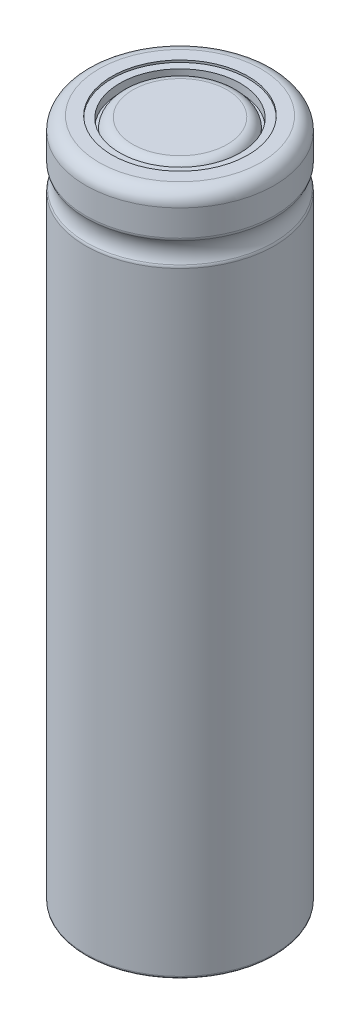
ISO-10303-21;
HEADER;
FILE_DESCRIPTION(('STEP AP214'),'2;1');
FILE_NAME('part.step','',(''),(''),'','','');
FILE_SCHEMA(('AUTOMOTIVE_DESIGN { 1 0 10303 214 1 1 1 1 }'));
ENDSEC;
DATA;
#1=APPLICATION_CONTEXT('core data for automotive mechanical design processes');
#2=APPLICATION_PROTOCOL_DEFINITION('international standard','automotive_design',2000,#1);
#3=PRODUCT_CONTEXT('',#1,'mechanical');
#4=PRODUCT('Part','Part','',(#3));
#5=PRODUCT_RELATED_PRODUCT_CATEGORY('part','',(#4));
#6=PRODUCT_DEFINITION_FORMATION('','',#4);
#7=PRODUCT_DEFINITION_CONTEXT('part definition',#1,'design');
#8=PRODUCT_DEFINITION('design','',#6,#7);
#9=PRODUCT_DEFINITION_SHAPE('','',#8);
#10=(LENGTH_UNIT() NAMED_UNIT(*) SI_UNIT(.MILLI.,.METRE.));
#11=(NAMED_UNIT(*) PLANE_ANGLE_UNIT() SI_UNIT($,.RADIAN.));
#12=(NAMED_UNIT(*) SI_UNIT($,.STERADIAN.) SOLID_ANGLE_UNIT());
#13=UNCERTAINTY_MEASURE_WITH_UNIT(LENGTH_MEASURE(1.E-05),#10,'distance_accuracy_value','');
#14=(GEOMETRIC_REPRESENTATION_CONTEXT(3) GLOBAL_UNCERTAINTY_ASSIGNED_CONTEXT((#13)) GLOBAL_UNIT_ASSIGNED_CONTEXT((#10,
#11,#12)) REPRESENTATION_CONTEXT('',''));
#15=CARTESIAN_POINT('',(0.,0.,0.));
#16=DIRECTION('',(0.,0.,1.));
#17=DIRECTION('',(1.,0.,0.));
#18=AXIS2_PLACEMENT_3D('',#15,#16,#17);
#19=CARTESIAN_POINT('',(0.,0.225400000000001,0.));
#20=DIRECTION('',(0.,-1.,0.));
#21=DIRECTION('',(0.,0.,1.));
#22=AXIS2_PLACEMENT_3D('',#19,#20,#21);
#23=PLANE('',#22);
#24=CARTESIAN_POINT('',(0.,0.225400000000001,0.));
#25=DIRECTION('',(0.,-1.,0.));
#26=DIRECTION('',(0.,0.,-1.));
#27=AXIS2_PLACEMENT_3D('',#24,#25,#26);
#28=CIRCLE('',#27,7.5);
#29=CARTESIAN_POINT('',(0.,0.225400000000001,7.5));
#30=VERTEX_POINT('',#29);
#31=EDGE_CURVE('E148',#30,#30,#28,.T.);
#32=ORIENTED_EDGE('',*,*,#31,.T.);
#33=EDGE_LOOP('',(#32));
#34=FACE_BOUND('',#33,.T.);
#35=ADVANCED_FACE('F16',(#34),#23,.T.);
#36=CARTESIAN_POINT('',(0.,64.873,7.73));
#37=DIRECTION('',(0.,1.,0.));
#38=DIRECTION('',(0.,0.,1.));
#39=AXIS2_PLACEMENT_3D('',#36,#37,#38);
#40=PLANE('',#39);
#41=CARTESIAN_POINT('',(0.,64.873,0.));
#42=DIRECTION('',(0.,1.,0.));
#43=DIRECTION('',(-1.,0.,0.));
#44=AXIS2_PLACEMENT_3D('',#41,#42,#43);
#45=CIRCLE('',#44,4.50617959368908);
#46=CARTESIAN_POINT('',(-4.50617959368908,64.873,0.));
#47=VERTEX_POINT('',#46);
#48=EDGE_CURVE('E152',#47,#47,#45,.T.);
#49=ORIENTED_EDGE('',*,*,#48,.T.);
#50=EDGE_LOOP('',(#49));
#51=FACE_BOUND('',#50,.T.);
#52=ADVANCED_FACE('F215',(#51),#40,.T.);
#53=CARTESIAN_POINT('',(0.,0.,0.));
#54=DIRECTION('',(0.,-1.,0.));
#55=DIRECTION('',(1.,0.,0.));
#56=AXIS2_PLACEMENT_3D('',#53,#54,#55);
#57=PLANE('',#56);
#58=CARTESIAN_POINT('',(0.,0.,0.));
#59=DIRECTION('',(0.,-1.,0.));
#60=DIRECTION('',(0.,0.,-1.));
#61=AXIS2_PLACEMENT_3D('',#58,#59,#60);
#62=CIRCLE('',#61,7.5);
#63=CARTESIAN_POINT('',(0.,0.,7.5));
#64=VERTEX_POINT('',#63);
#65=EDGE_CURVE('E138',#64,#64,#62,.T.);
#66=ORIENTED_EDGE('',*,*,#65,.F.);
#67=EDGE_LOOP('',(#66));
#68=FACE_BOUND('',#67,.T.);
#69=CARTESIAN_POINT('',(0.,0.,0.));
#70=DIRECTION('',(0.,1.,0.));
#71=DIRECTION('',(-1.,0.,0.));
#72=AXIS2_PLACEMENT_3D('',#69,#70,#71);
#73=CIRCLE('',#72,8.746);
#74=CARTESIAN_POINT('',(8.746,0.,0.));
#75=VERTEX_POINT('',#74);
#76=EDGE_CURVE('E108',#75,#75,#73,.T.);
#77=ORIENTED_EDGE('',*,*,#76,.F.);
#78=EDGE_LOOP('',(#77));
#79=FACE_BOUND('',#78,.T.);
#80=ADVANCED_FACE('F220',(#68,#79),#57,.T.);
#81=CARTESIAN_POINT('',(0.,65.,7.73));
#82=DIRECTION('',(0.,1.,0.));
#83=DIRECTION('',(0.,0.,1.));
#84=AXIS2_PLACEMENT_3D('',#81,#82,#83);
#85=PLANE('',#84);
#86=CARTESIAN_POINT('',(0.,65.,0.));
#87=DIRECTION('',(0.,-1.,0.));
#88=DIRECTION('',(-1.,0.,0.));
#89=AXIS2_PLACEMENT_3D('',#86,#87,#88);
#90=CIRCLE('',#89,6.5);
#91=CARTESIAN_POINT('',(6.5,65.,0.));
#92=VERTEX_POINT('',#91);
#93=EDGE_CURVE('E283',#92,#92,#90,.T.);
#94=ORIENTED_EDGE('',*,*,#93,.T.);
#95=EDGE_LOOP('',(#94));
#96=FACE_BOUND('',#95,.T.);
#97=CARTESIAN_POINT('',(0.,65.,0.));
#98=DIRECTION('',(0.,1.,0.));
#99=DIRECTION('',(-1.,0.,0.));
#100=AXIS2_PLACEMENT_3D('',#97,#98,#99);
#101=CIRCLE('',#100,7.73);
#102=CARTESIAN_POINT('',(7.73,65.,0.));
#103=VERTEX_POINT('',#102);
#104=EDGE_CURVE('E19',#103,#103,#101,.T.);
#105=ORIENTED_EDGE('',*,*,#104,.T.);
#106=EDGE_LOOP('',(#105));
#107=FACE_BOUND('',#106,.T.);
#108=ADVANCED_FACE('F197',(#96,#107),#85,.T.);
#109=CARTESIAN_POINT('',(0.,63.984,0.));
#110=DIRECTION('',(0.,1.,0.));
#111=DIRECTION('',(0.,0.,1.));
#112=AXIS2_PLACEMENT_3D('',#109,#110,#111);
#113=PLANE('',#112);
#114=CARTESIAN_POINT('',(0.,63.984,0.));
#115=DIRECTION('',(0.,1.,0.));
#116=DIRECTION('',(0.,0.,1.));
#117=AXIS2_PLACEMENT_3D('',#114,#115,#116);
#118=CIRCLE('',#117,5.5);
#119=CARTESIAN_POINT('',(-5.5,63.984,0.));
#120=VERTEX_POINT('',#119);
#121=EDGE_CURVE('E143',#120,#120,#118,.T.);
#122=ORIENTED_EDGE('',*,*,#121,.F.);
#123=EDGE_LOOP('',(#122));
#124=FACE_BOUND('',#123,.T.);
#125=CARTESIAN_POINT('',(0.,63.984,0.));
#126=DIRECTION('',(0.,1.,0.));
#127=DIRECTION('',(0.,0.,1.));
#128=AXIS2_PLACEMENT_3D('',#125,#126,#127);
#129=CIRCLE('',#128,5.75);
#130=CARTESIAN_POINT('',(0.,63.984,-5.75));
#131=VERTEX_POINT('',#130);
#132=EDGE_CURVE('E141',#131,#131,#129,.T.);
#133=ORIENTED_EDGE('',*,*,#132,.T.);
#134=EDGE_LOOP('',(#133));
#135=FACE_BOUND('',#134,.T.);
#136=ADVANCED_FACE('F201',(#124,#135),#113,.T.);
#137=CARTESIAN_POINT('',(0.,63.73,0.));
#138=DIRECTION('',(0.,1.,0.));
#139=DIRECTION('',(-1.,0.,0.));
#140=AXIS2_PLACEMENT_3D('',#137,#138,#139);
#141=TOROIDAL_SURFACE('',#140,7.73,1.27);
#142=ORIENTED_EDGE('',*,*,#104,.F.);
#143=CARTESIAN_POINT('',(7.73,63.73,0.));
#144=DIRECTION('',(0.,0.,-1.));
#145=DIRECTION('',(1.,0.,0.));
#146=AXIS2_PLACEMENT_3D('',#143,#144,#145);
#147=CIRCLE('',#146,1.27);
#148=CARTESIAN_POINT('',(9.,63.73,0.));
#149=VERTEX_POINT('',#148);
#150=EDGE_CURVE('E10',#103,#149,#147,.T.);
#151=ORIENTED_EDGE('',*,*,#150,.T.);
#152=CARTESIAN_POINT('',(0.,63.73,0.));
#153=DIRECTION('',(0.,1.,0.));
#154=DIRECTION('',(-1.,0.,0.));
#155=AXIS2_PLACEMENT_3D('',#152,#153,#154);
#156=CIRCLE('',#155,9.);
#157=EDGE_CURVE('E184',#149,#149,#156,.T.);
#158=ORIENTED_EDGE('',*,*,#157,.T.);
#159=ORIENTED_EDGE('',*,*,#150,.F.);
#160=EDGE_LOOP('',(#142,#151,#158,#159));
#161=FACE_BOUND('',#160,.T.);
#162=ADVANCED_FACE('F198',(#161),#141,.T.);
#163=CARTESIAN_POINT('',(0.,65.,0.));
#164=DIRECTION('',(0.,1.,0.));
#165=DIRECTION('',(-1.,0.,0.));
#166=AXIS2_PLACEMENT_3D('',#163,#164,#165);
#167=CYLINDRICAL_SURFACE('',#166,9.);
#168=ORIENTED_EDGE('',*,*,#157,.F.);
#169=DIRECTION('',(0.,-1.,0.));
#170=VECTOR('',#169,1.);
#171=CARTESIAN_POINT('',(9.,65.,0.));
#172=LINE('',#171,#170);
#173=CARTESIAN_POINT('',(9.,61.23,0.));
#174=VERTEX_POINT('',#173);
#175=EDGE_CURVE('E186',#149,#174,#172,.T.);
#176=ORIENTED_EDGE('',*,*,#175,.T.);
#177=CARTESIAN_POINT('',(0.,61.23,0.));
#178=DIRECTION('',(0.,-1.,0.));
#179=DIRECTION('',(1.,0.,0.));
#180=AXIS2_PLACEMENT_3D('',#177,#178,#179);
#181=CIRCLE('',#180,9.);
#182=CARTESIAN_POINT('',(-9.,61.23,0.));
#183=VERTEX_POINT('',#182);
#184=EDGE_CURVE('E177',#183,#174,#181,.T.);
#185=ORIENTED_EDGE('',*,*,#184,.F.);
#186=CARTESIAN_POINT('',(0.,61.23,0.));
#187=DIRECTION('',(0.,-1.,0.));
#188=DIRECTION('',(1.,0.,0.));
#189=AXIS2_PLACEMENT_3D('',#186,#187,#188);
#190=CIRCLE('',#189,9.);
#191=EDGE_CURVE('E181',#174,#183,#190,.T.);
#192=ORIENTED_EDGE('',*,*,#191,.F.);
#193=ORIENTED_EDGE('',*,*,#175,.F.);
#194=EDGE_LOOP('',(#168,#176,#185,#192,#193));
#195=FACE_BOUND('',#194,.T.);
#196=ADVANCED_FACE('F200',(#195),#167,.T.);
#197=CARTESIAN_POINT('',(0.,61.23,0.));
#198=DIRECTION('',(0.,-1.,0.));
#199=DIRECTION('',(1.,0.,0.));
#200=AXIS2_PLACEMENT_3D('',#197,#198,#199);
#201=TOROIDAL_SURFACE('',#200,8.5,0.5);
#202=CARTESIAN_POINT('',(0.,60.98,0.));
#203=DIRECTION('',(0.,-1.,0.));
#204=DIRECTION('',(1.,0.,0.));
#205=AXIS2_PLACEMENT_3D('',#202,#203,#204);
#206=CIRCLE('',#205,8.93301270189221);
#207=CARTESIAN_POINT('',(-8.93301270189221,60.98,0.));
#208=VERTEX_POINT('',#207);
#209=EDGE_CURVE('E136',#208,#208,#206,.T.);
#210=ORIENTED_EDGE('',*,*,#209,.F.);
#211=CARTESIAN_POINT('',(-8.5,61.23,0.));
#212=DIRECTION('',(0.,0.,-1.));
#213=DIRECTION('',(-1.,0.,0.));
#214=AXIS2_PLACEMENT_3D('',#211,#212,#213);
#215=CIRCLE('',#214,0.5);
#216=EDGE_CURVE('E121',#208,#183,#215,.T.);
#217=ORIENTED_EDGE('',*,*,#216,.T.);
#218=ORIENTED_EDGE('',*,*,#184,.T.);
#219=ORIENTED_EDGE('',*,*,#191,.T.);
#220=ORIENTED_EDGE('',*,*,#216,.F.);
#221=EDGE_LOOP('',(#210,#217,#218,#219,#220));
#222=FACE_BOUND('',#221,.T.);
#223=ADVANCED_FACE('F208',(#222),#201,.T.);
#224=CARTESIAN_POINT('',(0.,58.73,0.));
#225=DIRECTION('',(0.,-1.,0.));
#226=DIRECTION('',(1.,0.,0.));
#227=AXIS2_PLACEMENT_3D('',#224,#225,#226);
#228=TOROIDAL_SURFACE('',#227,8.5,0.5);
#229=CARTESIAN_POINT('',(0.,58.73,0.));
#230=DIRECTION('',(0.,-1.,0.));
#231=DIRECTION('',(1.,0.,0.));
#232=AXIS2_PLACEMENT_3D('',#229,#230,#231);
#233=CIRCLE('',#232,9.);
#234=CARTESIAN_POINT('',(-9.,58.73,0.));
#235=VERTEX_POINT('',#234);
#236=CARTESIAN_POINT('',(9.,58.73,0.));
#237=VERTEX_POINT('',#236);
#238=EDGE_CURVE('E156',#235,#237,#233,.T.);
#239=ORIENTED_EDGE('',*,*,#238,.F.);
#240=CARTESIAN_POINT('',(-8.5,58.73,0.));
#241=DIRECTION('',(0.,0.,-1.));
#242=DIRECTION('',(-1.,0.,0.));
#243=AXIS2_PLACEMENT_3D('',#240,#241,#242);
#244=CIRCLE('',#243,0.5);
#245=CARTESIAN_POINT('',(-8.93301270189221,58.98,0.));
#246=VERTEX_POINT('',#245);
#247=EDGE_CURVE('E115',#235,#246,#244,.T.);
#248=ORIENTED_EDGE('',*,*,#247,.T.);
#249=CARTESIAN_POINT('',(0.,58.98,0.));
#250=DIRECTION('',(0.,-1.,0.));
#251=DIRECTION('',(1.,0.,0.));
#252=AXIS2_PLACEMENT_3D('',#249,#250,#251);
#253=CIRCLE('',#252,8.93301270189221);
#254=EDGE_CURVE('E128',#246,#246,#253,.T.);
#255=ORIENTED_EDGE('',*,*,#254,.T.);
#256=ORIENTED_EDGE('',*,*,#247,.F.);
#257=CARTESIAN_POINT('',(0.,58.73,0.));
#258=DIRECTION('',(0.,-1.,0.));
#259=DIRECTION('',(1.,0.,0.));
#260=AXIS2_PLACEMENT_3D('',#257,#258,#259);
#261=CIRCLE('',#260,9.);
#262=EDGE_CURVE('E124',#237,#235,#261,.T.);
#263=ORIENTED_EDGE('',*,*,#262,.F.);
#264=EDGE_LOOP('',(#239,#248,#255,#256,#263));
#265=FACE_BOUND('',#264,.T.);
#266=ADVANCED_FACE('F245',(#265),#228,.T.);
#267=CARTESIAN_POINT('',(0.,0.254000000000004,0.));
#268=DIRECTION('',(0.,1.,0.));
#269=DIRECTION('',(-1.,0.,0.));
#270=AXIS2_PLACEMENT_3D('',#267,#268,#269);
#271=TOROIDAL_SURFACE('',#270,8.746,0.254);
#272=CARTESIAN_POINT('',(0.,0.254000000000004,0.));
#273=DIRECTION('',(0.,1.,0.));
#274=DIRECTION('',(-1.,0.,0.));
#275=AXIS2_PLACEMENT_3D('',#272,#273,#274);
#276=CIRCLE('',#275,9.);
#277=CARTESIAN_POINT('',(9.,0.254000000000004,0.));
#278=VERTEX_POINT('',#277);
#279=EDGE_CURVE('E132',#278,#278,#276,.T.);
#280=ORIENTED_EDGE('',*,*,#279,.F.);
#281=CARTESIAN_POINT('',(8.746,0.254000000000004,0.));
#282=DIRECTION('',(0.,0.,-1.));
#283=DIRECTION('',(1.,0.,0.));
#284=AXIS2_PLACEMENT_3D('',#281,#282,#283);
#285=CIRCLE('',#284,0.254);
#286=EDGE_CURVE('E111',#278,#75,#285,.T.);
#287=ORIENTED_EDGE('',*,*,#286,.T.);
#288=ORIENTED_EDGE('',*,*,#76,.T.);
#289=ORIENTED_EDGE('',*,*,#286,.F.);
#290=EDGE_LOOP('',(#280,#287,#288,#289));
#291=FACE_BOUND('',#290,.T.);
#292=ADVANCED_FACE('F110',(#291),#271,.T.);
#293=CARTESIAN_POINT('',(0.,65.,0.));
#294=DIRECTION('',(0.,1.,0.));
#295=DIRECTION('',(-1.,0.,0.));
#296=AXIS2_PLACEMENT_3D('',#293,#294,#295);
#297=CYLINDRICAL_SURFACE('',#296,9.);
#298=ORIENTED_EDGE('',*,*,#238,.T.);
#299=DIRECTION('',(0.,-1.,0.));
#300=VECTOR('',#299,1.);
#301=CARTESIAN_POINT('',(9.,65.,0.));
#302=LINE('',#301,#300);
#303=EDGE_CURVE('E160',#237,#278,#302,.T.);
#304=ORIENTED_EDGE('',*,*,#303,.T.);
#305=ORIENTED_EDGE('',*,*,#279,.T.);
#306=ORIENTED_EDGE('',*,*,#303,.F.);
#307=ORIENTED_EDGE('',*,*,#262,.T.);
#308=EDGE_LOOP('',(#298,#304,#305,#306,#307));
#309=FACE_BOUND('',#308,.T.);
#310=ADVANCED_FACE('F296',(#309),#297,.T.);
#311=CARTESIAN_POINT('',(0.,63.984,0.));
#312=DIRECTION('',(0.,1.,0.));
#313=DIRECTION('',(0.,0.,1.));
#314=AXIS2_PLACEMENT_3D('',#311,#312,#313);
#315=CYLINDRICAL_SURFACE('',#314,5.75);
#316=ORIENTED_EDGE('',*,*,#132,.F.);
#317=DIRECTION('',(0.,1.,0.));
#318=VECTOR('',#317,1.);
#319=CARTESIAN_POINT('',(0.,63.984,-5.75));
#320=LINE('',#319,#318);
#321=CARTESIAN_POINT('',(0.,64.8,-5.75));
#322=VERTEX_POINT('',#321);
#323=EDGE_CURVE('E161',#131,#322,#320,.T.);
#324=ORIENTED_EDGE('',*,*,#323,.T.);
#325=CARTESIAN_POINT('',(0.,64.8,0.));
#326=DIRECTION('',(0.,1.,0.));
#327=DIRECTION('',(0.,0.,1.));
#328=AXIS2_PLACEMENT_3D('',#325,#326,#327);
#329=CIRCLE('',#328,5.75);
#330=EDGE_CURVE('E278',#322,#322,#329,.T.);
#331=ORIENTED_EDGE('',*,*,#330,.T.);
#332=ORIENTED_EDGE('',*,*,#323,.F.);
#333=EDGE_LOOP('',(#316,#324,#331,#332));
#334=FACE_BOUND('',#333,.T.);
#335=ADVANCED_FACE('F298',(#334),#315,.F.);
#336=CARTESIAN_POINT('',(0.,0.0254000000000018,0.));
#337=DIRECTION('',(0.,-1.,0.));
#338=DIRECTION('',(0.,0.,-1.));
#339=AXIS2_PLACEMENT_3D('',#336,#337,#338);
#340=CYLINDRICAL_SURFACE('',#339,7.5);
#341=ORIENTED_EDGE('',*,*,#31,.F.);
#342=DIRECTION('',(0.,-1.,0.));
#343=VECTOR('',#342,1.);
#344=CARTESIAN_POINT('',(0.,0.0254000000000018,7.5));
#345=LINE('',#344,#343);
#346=EDGE_CURVE('E142',#30,#64,#345,.T.);
#347=ORIENTED_EDGE('',*,*,#346,.T.);
#348=ORIENTED_EDGE('',*,*,#65,.T.);
#349=ORIENTED_EDGE('',*,*,#346,.F.);
#350=EDGE_LOOP('',(#341,#347,#348,#349));
#351=FACE_BOUND('',#350,.T.);
#352=ADVANCED_FACE('F225',(#351),#340,.F.);
#353=CARTESIAN_POINT('',(0.,63.873,0.));
#354=DIRECTION('',(0.,-1.,0.));
#355=DIRECTION('',(1.,0.,0.));
#356=AXIS2_PLACEMENT_3D('',#353,#354,#355);
#357=TOROIDAL_SURFACE('',#356,4.50617959368908,1.);
#358=ORIENTED_EDGE('',*,*,#121,.T.);
#359=CARTESIAN_POINT('',(-4.50617959368908,63.873,0.));
#360=DIRECTION('',(0.,0.,-1.));
#361=DIRECTION('',(-1.,0.,0.));
#362=AXIS2_PLACEMENT_3D('',#359,#360,#361);
#363=CIRCLE('',#362,1.);
#364=EDGE_CURVE('E147',#120,#47,#363,.T.);
#365=ORIENTED_EDGE('',*,*,#364,.T.);
#366=ORIENTED_EDGE('',*,*,#48,.F.);
#367=ORIENTED_EDGE('',*,*,#364,.F.);
#368=EDGE_LOOP('',(#358,#365,#366,#367));
#369=FACE_BOUND('',#368,.T.);
#370=ADVANCED_FACE('F274',(#369),#357,.T.);
#371=CARTESIAN_POINT('',(0.,59.98,0.));
#372=DIRECTION('',(0.,-1.,0.));
#373=DIRECTION('',(1.,0.,0.));
#374=AXIS2_PLACEMENT_3D('',#371,#372,#373);
#375=TOROIDAL_SURFACE('',#374,10.6650635094611,2.);
#376=ORIENTED_EDGE('',*,*,#254,.F.);
#377=CARTESIAN_POINT('',(-10.6650635094611,59.98,0.));
#378=DIRECTION('',(0.,0.,1.));
#379=DIRECTION('',(-1.,0.,0.));
#380=AXIS2_PLACEMENT_3D('',#377,#378,#379);
#381=CIRCLE('',#380,2.);
#382=EDGE_CURVE('E133',#246,#208,#381,.T.);
#383=ORIENTED_EDGE('',*,*,#382,.T.);
#384=ORIENTED_EDGE('',*,*,#209,.T.);
#385=ORIENTED_EDGE('',*,*,#382,.F.);
#386=EDGE_LOOP('',(#376,#383,#384,#385));
#387=FACE_BOUND('',#386,.T.);
#388=ADVANCED_FACE('F241',(#387),#375,.F.);
#389=CARTESIAN_POINT('',(0.,64.8,0.));
#390=DIRECTION('',(0.,1.,0.));
#391=DIRECTION('',(-1.,0.,0.));
#392=AXIS2_PLACEMENT_3D('',#389,#390,#391);
#393=PLANE('',#392);
#394=ORIENTED_EDGE('',*,*,#330,.F.);
#395=EDGE_LOOP('',(#394));
#396=FACE_BOUND('',#395,.T.);
#397=CARTESIAN_POINT('',(0.,64.8,0.));
#398=DIRECTION('',(0.,-1.,0.));
#399=DIRECTION('',(-1.,0.,0.));
#400=AXIS2_PLACEMENT_3D('',#397,#398,#399);
#401=CIRCLE('',#400,6.5);
#402=CARTESIAN_POINT('',(6.5,64.8,0.));
#403=VERTEX_POINT('',#402);
#404=EDGE_CURVE('E233',#403,#403,#401,.T.);
#405=ORIENTED_EDGE('',*,*,#404,.F.);
#406=EDGE_LOOP('',(#405));
#407=FACE_BOUND('',#406,.T.);
#408=ADVANCED_FACE('F266',(#396,#407),#393,.T.);
#409=CARTESIAN_POINT('',(0.,65.,0.));
#410=DIRECTION('',(0.,-1.,0.));
#411=DIRECTION('',(-1.,0.,0.));
#412=AXIS2_PLACEMENT_3D('',#409,#410,#411);
#413=CYLINDRICAL_SURFACE('',#412,6.5);
#414=ORIENTED_EDGE('',*,*,#93,.F.);
#415=DIRECTION('',(0.,-1.,0.));
#416=VECTOR('',#415,1.);
#417=CARTESIAN_POINT('',(6.5,65.,0.));
#418=LINE('',#417,#416);
#419=EDGE_CURVE('E281',#92,#403,#418,.T.);
#420=ORIENTED_EDGE('',*,*,#419,.T.);
#421=ORIENTED_EDGE('',*,*,#404,.T.);
#422=ORIENTED_EDGE('',*,*,#419,.F.);
#423=EDGE_LOOP('',(#414,#420,#421,#422));
#424=FACE_BOUND('',#423,.T.);
#425=ADVANCED_FACE('F265',(#424),#413,.F.);
#426=CLOSED_SHELL('',(#35,#52,#80,#108,#136,#162,#196,#223,#266,#292,#310,#335,#352,#370,#388,
#408,#425));
#427=MANIFOLD_SOLID_BREP('B1',#426);
#428=ADVANCED_BREP_SHAPE_REPRESENTATION('',(#18,#427),#14);
#429=SHAPE_DEFINITION_REPRESENTATION(#9,#428);
ENDSEC;
END-ISO-10303-21;
